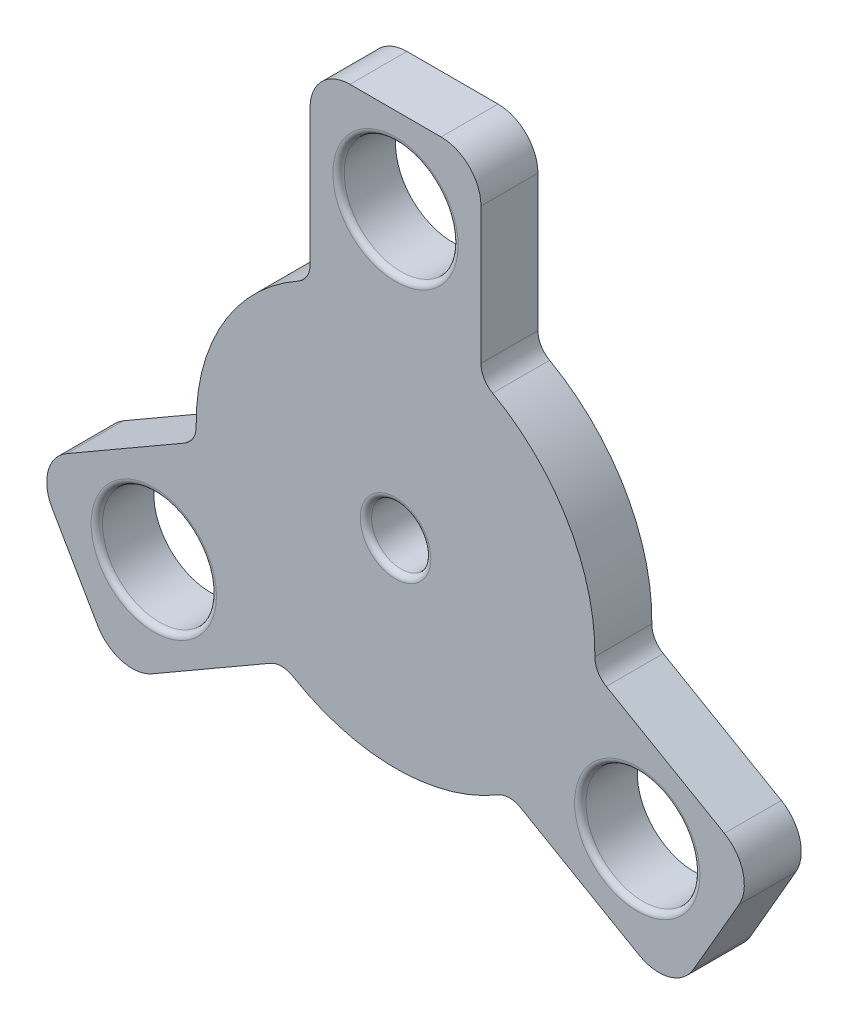
ISO-10303-21;
HEADER;
FILE_DESCRIPTION(('STEP AP214'),'2;1');
FILE_NAME('part.step','',(''),(''),'','','');
FILE_SCHEMA(('AUTOMOTIVE_DESIGN { 1 0 10303 214 1 1 1 1 }'));
ENDSEC;
DATA;
#1=APPLICATION_CONTEXT('core data for automotive mechanical design processes');
#2=APPLICATION_PROTOCOL_DEFINITION('international standard','automotive_design',2000,#1);
#3=PRODUCT_CONTEXT('',#1,'mechanical');
#4=PRODUCT('Part','Part','',(#3));
#5=PRODUCT_RELATED_PRODUCT_CATEGORY('part','',(#4));
#6=PRODUCT_DEFINITION_FORMATION('','',#4);
#7=PRODUCT_DEFINITION_CONTEXT('part definition',#1,'design');
#8=PRODUCT_DEFINITION('design','',#6,#7);
#9=PRODUCT_DEFINITION_SHAPE('','',#8);
#10=(LENGTH_UNIT() NAMED_UNIT(*) SI_UNIT(.MILLI.,.METRE.));
#11=(NAMED_UNIT(*) PLANE_ANGLE_UNIT() SI_UNIT($,.RADIAN.));
#12=(NAMED_UNIT(*) SI_UNIT($,.STERADIAN.) SOLID_ANGLE_UNIT());
#13=UNCERTAINTY_MEASURE_WITH_UNIT(LENGTH_MEASURE(1.E-05),#10,'distance_accuracy_value','');
#14=(GEOMETRIC_REPRESENTATION_CONTEXT(3) GLOBAL_UNCERTAINTY_ASSIGNED_CONTEXT((#13)) GLOBAL_UNIT_ASSIGNED_CONTEXT((#10,
#11,#12)) REPRESENTATION_CONTEXT('',''));
#15=CARTESIAN_POINT('',(0.,0.,0.));
#16=DIRECTION('',(0.,0.,1.));
#17=DIRECTION('',(1.,0.,0.));
#18=AXIS2_PLACEMENT_3D('',#15,#16,#17);
#19=CARTESIAN_POINT('',(3.75000000000002,-6.49519052838327,5.));
#20=DIRECTION('',(-0.500000000000003,0.866025403784437,0.));
#21=DIRECTION('',(-0.866025403784437,-0.500000000000003,0.));
#22=AXIS2_PLACEMENT_3D('',#19,#20,#21);
#23=PLANE('',#22);
#24=DIRECTION('',(0.866025403784437,0.500000000000003,0.));
#25=VECTOR('',#24,1.);
#26=CARTESIAN_POINT('',(3.75000000000002,-6.49519052838327,0.));
#27=LINE('',#26,#25);
#28=CARTESIAN_POINT('',(-21.3647367097487,-20.9951905283834,0.));
#29=VERTEX_POINT('',#28);
#30=CARTESIAN_POINT('',(-10.9978812037526,-15.0098837113465,0.));
#31=VERTEX_POINT('',#30);
#32=EDGE_CURVE('E556',#29,#31,#27,.T.);
#33=ORIENTED_EDGE('',*,*,#32,.T.);
#34=DIRECTION('',(0.,0.,1.));
#35=VECTOR('',#34,1.);
#36=CARTESIAN_POINT('',(-10.9978812037526,-15.0098837113465,5.));
#37=LINE('',#36,#35);
#38=CARTESIAN_POINT('',(-10.9978812037526,-15.0098837113465,5.));
#39=VERTEX_POINT('',#38);
#40=EDGE_CURVE('E353',#31,#39,#37,.T.);
#41=ORIENTED_EDGE('',*,*,#40,.T.);
#42=DIRECTION('',(0.866025403784437,0.500000000000003,0.));
#43=VECTOR('',#42,1.);
#44=CARTESIAN_POINT('',(3.75000000000002,-6.49519052838327,5.));
#45=LINE('',#44,#43);
#46=CARTESIAN_POINT('',(-21.3647367097487,-20.9951905283834,5.));
#47=VERTEX_POINT('',#46);
#48=EDGE_CURVE('E593',#47,#39,#45,.T.);
#49=ORIENTED_EDGE('',*,*,#48,.F.);
#50=DIRECTION('',(0.,0.,-1.));
#51=VECTOR('',#50,1.);
#52=CARTESIAN_POINT('',(-21.3647367097487,-20.9951905283833,5.));
#53=LINE('',#52,#51);
#54=EDGE_CURVE('E314',#47,#29,#53,.T.);
#55=ORIENTED_EDGE('',*,*,#54,.T.);
#56=EDGE_LOOP('',(#33,#41,#49,#55));
#57=FACE_BOUND('',#56,.T.);
#58=ADVANCED_FACE('F47',(#57),#23,.F.);
#59=CARTESIAN_POINT('',(0.,0.,5.));
#60=DIRECTION('',(0.,0.,-1.));
#61=DIRECTION('',(-1.,0.,0.));
#62=AXIS2_PLACEMENT_3D('',#59,#60,#61);
#63=CYLINDRICAL_SURFACE('',#62,17.5);
#64=CARTESIAN_POINT('',(0.,0.,5.));
#65=DIRECTION('',(0.,0.,1.));
#66=DIRECTION('',(1.,0.,0.));
#67=AXIS2_PLACEMENT_3D('',#64,#65,#66);
#68=CIRCLE('',#67,17.5);
#69=CARTESIAN_POINT('',(-8.97245749054719,-15.0248130297959,5.));
#70=VERTEX_POINT('',#69);
#71=CARTESIAN_POINT('',(8.97245749054727,-15.0248130297958,5.));
#72=VERTEX_POINT('',#71);
#73=EDGE_CURVE('E590',#70,#72,#68,.T.);
#74=ORIENTED_EDGE('',*,*,#73,.F.);
#75=DIRECTION('',(0.,0.,-1.));
#76=VECTOR('',#75,1.);
#77=CARTESIAN_POINT('',(-8.97245749054719,-15.0248130297959,5.));
#78=LINE('',#77,#76);
#79=CARTESIAN_POINT('',(-8.97245749054719,-15.0248130297959,0.));
#80=VERTEX_POINT('',#79);
#81=EDGE_CURVE('E349',#70,#80,#78,.T.);
#82=ORIENTED_EDGE('',*,*,#81,.T.);
#83=CARTESIAN_POINT('',(0.,0.,0.));
#84=DIRECTION('',(0.,0.,1.));
#85=DIRECTION('',(1.,0.,0.));
#86=AXIS2_PLACEMENT_3D('',#83,#84,#85);
#87=CIRCLE('',#86,17.5);
#88=CARTESIAN_POINT('',(8.97245749054727,-15.0248130297958,0.));
#89=VERTEX_POINT('',#88);
#90=EDGE_CURVE('E552',#80,#89,#87,.T.);
#91=ORIENTED_EDGE('',*,*,#90,.T.);
#92=DIRECTION('',(0.,0.,-1.));
#93=VECTOR('',#92,1.);
#94=CARTESIAN_POINT('',(8.97245749054727,-15.0248130297958,5.));
#95=LINE('',#94,#93);
#96=EDGE_CURVE('E346',#89,#72,#95,.F.);
#97=ORIENTED_EDGE('',*,*,#96,.T.);
#98=EDGE_LOOP('',(#74,#82,#91,#97));
#99=FACE_BOUND('',#98,.T.);
#100=ADVANCED_FACE('F437',(#99),#63,.T.);
#101=CARTESIAN_POINT('',(-3.74999999999998,-6.49519052838328,5.));
#102=DIRECTION('',(-0.499999999999998,-0.86602540378444,0.));
#103=DIRECTION('',(0.86602540378444,-0.499999999999998,0.));
#104=AXIS2_PLACEMENT_3D('',#101,#102,#103);
#105=PLANE('',#104);
#106=DIRECTION('',(-0.86602540378444,0.499999999999998,0.));
#107=VECTOR('',#106,1.);
#108=CARTESIAN_POINT('',(-3.74999999999998,-6.49519052838328,5.));
#109=LINE('',#108,#107);
#110=CARTESIAN_POINT('',(21.3647367097488,-20.9951905283832,5.));
#111=VERTEX_POINT('',#110);
#112=CARTESIAN_POINT('',(10.9978812037527,-15.0098837113465,5.));
#113=VERTEX_POINT('',#112);
#114=EDGE_CURVE('E587',#111,#113,#109,.T.);
#115=ORIENTED_EDGE('',*,*,#114,.T.);
#116=DIRECTION('',(0.,0.,-1.));
#117=VECTOR('',#116,1.);
#118=CARTESIAN_POINT('',(10.9978812037527,-15.0098837113465,5.));
#119=LINE('',#118,#117);
#120=CARTESIAN_POINT('',(10.9978812037527,-15.0098837113465,0.));
#121=VERTEX_POINT('',#120);
#122=EDGE_CURVE('E356',#113,#121,#119,.T.);
#123=ORIENTED_EDGE('',*,*,#122,.T.);
#124=DIRECTION('',(-0.86602540378444,0.499999999999998,0.));
#125=VECTOR('',#124,1.);
#126=CARTESIAN_POINT('',(-3.74999999999998,-6.49519052838328,0.));
#127=LINE('',#126,#125);
#128=CARTESIAN_POINT('',(21.3647367097488,-20.9951905283832,0.));
#129=VERTEX_POINT('',#128);
#130=EDGE_CURVE('E236',#129,#121,#127,.T.);
#131=ORIENTED_EDGE('',*,*,#130,.F.);
#132=DIRECTION('',(0.,0.,-1.));
#133=VECTOR('',#132,1.);
#134=CARTESIAN_POINT('',(21.3647367097488,-20.9951905283832,5.));
#135=LINE('',#134,#133);
#136=EDGE_CURVE('E267',#129,#111,#135,.F.);
#137=ORIENTED_EDGE('',*,*,#136,.T.);
#138=EDGE_LOOP('',(#115,#123,#131,#137));
#139=FACE_BOUND('',#138,.T.);
#140=ADVANCED_FACE('F444',(#139),#105,.T.);
#141=CARTESIAN_POINT('',(28.1458256229943,-16.2499999999999,5.));
#142=DIRECTION('',(0.86602540378444,-0.499999999999998,0.));
#143=DIRECTION('',(0.499999999999998,0.86602540378444,0.));
#144=AXIS2_PLACEMENT_3D('',#141,#142,#143);
#145=PLANE('',#144);
#146=DIRECTION('',(-0.499999999999998,-0.86602540378444,0.));
#147=VECTOR('',#146,1.);
#148=CARTESIAN_POINT('',(28.1458256229943,-16.2499999999999,5.));
#149=LINE('',#148,#147);
#150=CARTESIAN_POINT('',(30.1458256229943,-12.7858983848622,5.));
#151=VERTEX_POINT('',#150);
#152=CARTESIAN_POINT('',(26.1458256229943,-19.7141016151377,5.));
#153=VERTEX_POINT('',#152);
#154=EDGE_CURVE('E584',#151,#153,#149,.T.);
#155=ORIENTED_EDGE('',*,*,#154,.T.);
#156=DIRECTION('',(0.,0.,-1.));
#157=VECTOR('',#156,1.);
#158=CARTESIAN_POINT('',(26.1458256229943,-19.7141016151377,5.));
#159=LINE('',#158,#157);
#160=CARTESIAN_POINT('',(26.1458256229943,-19.7141016151377,0.));
#161=VERTEX_POINT('',#160);
#162=EDGE_CURVE('E234',#153,#161,#159,.T.);
#163=ORIENTED_EDGE('',*,*,#162,.T.);
#164=DIRECTION('',(-0.499999999999998,-0.86602540378444,0.));
#165=VECTOR('',#164,1.);
#166=CARTESIAN_POINT('',(28.1458256229943,-16.2499999999999,0.));
#167=LINE('',#166,#165);
#168=CARTESIAN_POINT('',(30.1458256229943,-12.7858983848622,0.));
#169=VERTEX_POINT('',#168);
#170=EDGE_CURVE('E216',#169,#161,#167,.T.);
#171=ORIENTED_EDGE('',*,*,#170,.F.);
#172=DIRECTION('',(0.,0.,-1.));
#173=VECTOR('',#172,1.);
#174=CARTESIAN_POINT('',(30.1458256229943,-12.7858983848622,5.));
#175=LINE('',#174,#173);
#176=EDGE_CURVE('E231',#169,#151,#175,.F.);
#177=ORIENTED_EDGE('',*,*,#176,.T.);
#178=EDGE_LOOP('',(#155,#163,#171,#177));
#179=FACE_BOUND('',#178,.T.);
#180=ADVANCED_FACE('F230',(#179),#145,.T.);
#181=CARTESIAN_POINT('',(3.74999999999999,6.4951905283833,5.));
#182=DIRECTION('',(-0.499999999999998,-0.86602540378444,0.));
#183=DIRECTION('',(0.86602540378444,-0.499999999999998,0.));
#184=AXIS2_PLACEMENT_3D('',#181,#182,#183);
#185=PLANE('',#184);
#186=DIRECTION('',(-0.86602540378444,0.499999999999998,0.));
#187=VECTOR('',#186,1.);
#188=CARTESIAN_POINT('',(3.74999999999999,6.4951905283833,0.));
#189=LINE('',#188,#187);
#190=CARTESIAN_POINT('',(28.8647367097488,-8.00480947161664,0.));
#191=VERTEX_POINT('',#190);
#192=CARTESIAN_POINT('',(18.4978812037526,-2.01950265457986,0.));
#193=VERTEX_POINT('',#192);
#194=EDGE_CURVE('E218',#191,#193,#189,.T.);
#195=ORIENTED_EDGE('',*,*,#194,.T.);
#196=DIRECTION('',(0.,0.,1.));
#197=VECTOR('',#196,1.);
#198=CARTESIAN_POINT('',(18.4978812037526,-2.01950265457986,5.));
#199=LINE('',#198,#197);
#200=CARTESIAN_POINT('',(18.4978812037526,-2.01950265457986,5.));
#201=VERTEX_POINT('',#200);
#202=EDGE_CURVE('E339',#193,#201,#199,.T.);
#203=ORIENTED_EDGE('',*,*,#202,.T.);
#204=DIRECTION('',(-0.86602540378444,0.499999999999998,0.));
#205=VECTOR('',#204,1.);
#206=CARTESIAN_POINT('',(3.74999999999999,6.4951905283833,5.));
#207=LINE('',#206,#205);
#208=CARTESIAN_POINT('',(28.8647367097488,-8.00480947161664,5.));
#209=VERTEX_POINT('',#208);
#210=EDGE_CURVE('E580',#209,#201,#207,.T.);
#211=ORIENTED_EDGE('',*,*,#210,.F.);
#212=DIRECTION('',(0.,0.,-1.));
#213=VECTOR('',#212,1.);
#214=CARTESIAN_POINT('',(28.8647367097487,-8.00480947161664,0.));
#215=LINE('',#214,#213);
#216=EDGE_CURVE('E287',#209,#191,#215,.T.);
#217=ORIENTED_EDGE('',*,*,#216,.T.);
#218=EDGE_LOOP('',(#195,#203,#211,#217));
#219=FACE_BOUND('',#218,.T.);
#220=ADVANCED_FACE('F635',(#219),#185,.F.);
#221=CARTESIAN_POINT('',(17.4980985161883,-0.257969606291903,5.));
#222=VERTEX_POINT('',#221);
#223=CARTESIAN_POINT('',(8.52564102564103,15.2827826360878,5.));
#224=VERTEX_POINT('',#223);
#225=EDGE_CURVE('E579',#222,#224,#68,.T.);
#226=ORIENTED_EDGE('',*,*,#225,.F.);
#227=DIRECTION('',(0.,0.,-1.));
#228=VECTOR('',#227,1.);
#229=CARTESIAN_POINT('',(17.4980985161883,-0.257969606291903,5.));
#230=LINE('',#229,#228);
#231=CARTESIAN_POINT('',(17.4980985161883,-0.257969606291903,0.));
#232=VERTEX_POINT('',#231);
#233=EDGE_CURVE('E335',#222,#232,#230,.T.);
#234=ORIENTED_EDGE('',*,*,#233,.T.);
#235=CARTESIAN_POINT('',(8.52564102564103,15.2827826360878,0.));
#236=VERTEX_POINT('',#235);
#237=EDGE_CURVE('E546',#232,#236,#87,.T.);
#238=ORIENTED_EDGE('',*,*,#237,.T.);
#239=DIRECTION('',(0.,0.,-1.));
#240=VECTOR('',#239,1.);
#241=CARTESIAN_POINT('',(8.52564102564103,15.2827826360878,5.));
#242=LINE('',#241,#240);
#243=EDGE_CURVE('E332',#236,#224,#242,.F.);
#244=ORIENTED_EDGE('',*,*,#243,.T.);
#245=EDGE_LOOP('',(#226,#234,#238,#244));
#246=FACE_BOUND('',#245,.T.);
#247=ADVANCED_FACE('F447',(#246),#63,.T.);
#248=CARTESIAN_POINT('',(7.5,0.,5.));
#249=DIRECTION('',(1.,0.,0.));
#250=DIRECTION('',(0.,1.,0.));
#251=AXIS2_PLACEMENT_3D('',#248,#249,#250);
#252=PLANE('',#251);
#253=DIRECTION('',(0.,-1.,0.));
#254=VECTOR('',#253,1.);
#255=CARTESIAN_POINT('',(7.5,0.,5.));
#256=LINE('',#255,#254);
#257=CARTESIAN_POINT('',(7.5,29.,5.));
#258=VERTEX_POINT('',#257);
#259=CARTESIAN_POINT('',(7.5,17.0293863659264,5.));
#260=VERTEX_POINT('',#259);
#261=EDGE_CURVE('E575',#258,#260,#256,.T.);
#262=ORIENTED_EDGE('',*,*,#261,.T.);
#263=DIRECTION('',(0.,0.,-1.));
#264=VECTOR('',#263,1.);
#265=CARTESIAN_POINT('',(7.5,17.0293863659264,5.));
#266=LINE('',#265,#264);
#267=CARTESIAN_POINT('',(7.5,17.0293863659264,0.));
#268=VERTEX_POINT('',#267);
#269=EDGE_CURVE('E342',#260,#268,#266,.T.);
#270=ORIENTED_EDGE('',*,*,#269,.T.);
#271=DIRECTION('',(0.,-1.,0.));
#272=VECTOR('',#271,1.);
#273=CARTESIAN_POINT('',(7.5,0.,0.));
#274=LINE('',#273,#272);
#275=CARTESIAN_POINT('',(7.5,29.,0.));
#276=VERTEX_POINT('',#275);
#277=EDGE_CURVE('E542',#276,#268,#274,.T.);
#278=ORIENTED_EDGE('',*,*,#277,.F.);
#279=DIRECTION('',(0.,0.,-1.));
#280=VECTOR('',#279,1.);
#281=CARTESIAN_POINT('',(7.5,29.,5.));
#282=LINE('',#281,#280);
#283=EDGE_CURVE('E297',#276,#258,#282,.F.);
#284=ORIENTED_EDGE('',*,*,#283,.T.);
#285=EDGE_LOOP('',(#262,#270,#278,#284));
#286=FACE_BOUND('',#285,.T.);
#287=ADVANCED_FACE('F630',(#286),#252,.T.);
#288=CARTESIAN_POINT('',(0.,32.5,5.));
#289=DIRECTION('',(0.,1.,0.));
#290=DIRECTION('',(0.,0.,1.));
#291=AXIS2_PLACEMENT_3D('',#288,#289,#290);
#292=PLANE('',#291);
#293=DIRECTION('',(1.,0.,0.));
#294=VECTOR('',#293,1.);
#295=CARTESIAN_POINT('',(0.,32.5,5.));
#296=LINE('',#295,#294);
#297=CARTESIAN_POINT('',(-4.,32.5,5.));
#298=VERTEX_POINT('',#297);
#299=CARTESIAN_POINT('',(4.,32.5,5.));
#300=VERTEX_POINT('',#299);
#301=EDGE_CURVE('E571',#298,#300,#296,.T.);
#302=ORIENTED_EDGE('',*,*,#301,.T.);
#303=DIRECTION('',(0.,0.,-1.));
#304=VECTOR('',#303,1.);
#305=CARTESIAN_POINT('',(4.,32.5,5.));
#306=LINE('',#305,#304);
#307=CARTESIAN_POINT('',(4.,32.5,0.));
#308=VERTEX_POINT('',#307);
#309=EDGE_CURVE('E293',#300,#308,#306,.T.);
#310=ORIENTED_EDGE('',*,*,#309,.T.);
#311=DIRECTION('',(1.,0.,0.));
#312=VECTOR('',#311,1.);
#313=CARTESIAN_POINT('',(0.,32.5,0.));
#314=LINE('',#313,#312);
#315=CARTESIAN_POINT('',(-4.,32.5,0.));
#316=VERTEX_POINT('',#315);
#317=EDGE_CURVE('E538',#316,#308,#314,.T.);
#318=ORIENTED_EDGE('',*,*,#317,.F.);
#319=DIRECTION('',(0.,0.,-1.));
#320=VECTOR('',#319,1.);
#321=CARTESIAN_POINT('',(-4.,32.5,5.));
#322=LINE('',#321,#320);
#323=EDGE_CURVE('E290',#316,#298,#322,.F.);
#324=ORIENTED_EDGE('',*,*,#323,.T.);
#325=EDGE_LOOP('',(#302,#310,#318,#324));
#326=FACE_BOUND('',#325,.T.);
#327=ADVANCED_FACE('F626',(#326),#292,.T.);
#328=CARTESIAN_POINT('',(-7.5,0.,5.));
#329=DIRECTION('',(1.,0.,0.));
#330=DIRECTION('',(0.,1.,0.));
#331=AXIS2_PLACEMENT_3D('',#328,#329,#330);
#332=PLANE('',#331);
#333=DIRECTION('',(0.,-1.,0.));
#334=VECTOR('',#333,1.);
#335=CARTESIAN_POINT('',(-7.5,0.,0.));
#336=LINE('',#335,#334);
#337=CARTESIAN_POINT('',(-7.5,29.,0.));
#338=VERTEX_POINT('',#337);
#339=CARTESIAN_POINT('',(-7.5,17.0293863659264,0.));
#340=VERTEX_POINT('',#339);
#341=EDGE_CURVE('E534',#338,#340,#336,.T.);
#342=ORIENTED_EDGE('',*,*,#341,.T.);
#343=DIRECTION('',(0.,0.,1.));
#344=VECTOR('',#343,1.);
#345=CARTESIAN_POINT('',(-7.5,17.0293863659264,5.));
#346=LINE('',#345,#344);
#347=CARTESIAN_POINT('',(-7.5,17.0293863659264,5.));
#348=VERTEX_POINT('',#347);
#349=EDGE_CURVE('E329',#340,#348,#346,.T.);
#350=ORIENTED_EDGE('',*,*,#349,.T.);
#351=DIRECTION('',(0.,-1.,0.));
#352=VECTOR('',#351,1.);
#353=CARTESIAN_POINT('',(-7.5,0.,5.));
#354=LINE('',#353,#352);
#355=CARTESIAN_POINT('',(-7.5,29.,5.));
#356=VERTEX_POINT('',#355);
#357=EDGE_CURVE('E567',#356,#348,#354,.T.);
#358=ORIENTED_EDGE('',*,*,#357,.F.);
#359=DIRECTION('',(0.,0.,-1.));
#360=VECTOR('',#359,1.);
#361=CARTESIAN_POINT('',(-7.5,29.,0.));
#362=LINE('',#361,#360);
#363=EDGE_CURVE('E300',#356,#338,#362,.T.);
#364=ORIENTED_EDGE('',*,*,#363,.T.);
#365=EDGE_LOOP('',(#342,#350,#358,#364));
#366=FACE_BOUND('',#365,.T.);
#367=ADVANCED_FACE('F622',(#366),#332,.F.);
#368=CARTESIAN_POINT('',(-8.52564102564103,15.2827826360878,0.));
#369=VERTEX_POINT('',#368);
#370=CARTESIAN_POINT('',(-17.4980985161883,-0.257969606292012,0.));
#371=VERTEX_POINT('',#370);
#372=EDGE_CURVE('E533',#369,#371,#87,.T.);
#373=ORIENTED_EDGE('',*,*,#372,.T.);
#374=DIRECTION('',(0.,0.,-1.));
#375=VECTOR('',#374,1.);
#376=CARTESIAN_POINT('',(-17.4980985161883,-0.257969606292012,5.));
#377=LINE('',#376,#375);
#378=CARTESIAN_POINT('',(-17.4980985161883,-0.257969606292012,5.));
#379=VERTEX_POINT('',#378);
#380=EDGE_CURVE('E326',#371,#379,#377,.F.);
#381=ORIENTED_EDGE('',*,*,#380,.T.);
#382=CARTESIAN_POINT('',(-8.52564102564103,15.2827826360878,5.));
#383=VERTEX_POINT('',#382);
#384=EDGE_CURVE('E566',#383,#379,#68,.T.);
#385=ORIENTED_EDGE('',*,*,#384,.F.);
#386=DIRECTION('',(0.,0.,-1.));
#387=VECTOR('',#386,1.);
#388=CARTESIAN_POINT('',(-8.52564102564103,15.2827826360878,5.));
#389=LINE('',#388,#387);
#390=EDGE_CURVE('E322',#383,#369,#389,.T.);
#391=ORIENTED_EDGE('',*,*,#390,.T.);
#392=EDGE_LOOP('',(#373,#381,#385,#391));
#393=FACE_BOUND('',#392,.T.);
#394=ADVANCED_FACE('F448',(#393),#63,.T.);
#395=CARTESIAN_POINT('',(-3.75,6.49519052838327,5.));
#396=DIRECTION('',(-0.500000000000002,0.866025403784438,0.));
#397=DIRECTION('',(-0.866025403784438,-0.500000000000002,0.));
#398=AXIS2_PLACEMENT_3D('',#395,#396,#397);
#399=PLANE('',#398);
#400=DIRECTION('',(0.866025403784438,0.500000000000002,0.));
#401=VECTOR('',#400,1.);
#402=CARTESIAN_POINT('',(-3.75,6.49519052838327,5.));
#403=LINE('',#402,#401);
#404=CARTESIAN_POINT('',(-28.8647367097487,-8.00480947161679,5.));
#405=VERTEX_POINT('',#404);
#406=CARTESIAN_POINT('',(-18.4978812037526,-2.01950265457997,5.));
#407=VERTEX_POINT('',#406);
#408=EDGE_CURVE('E249',#405,#407,#403,.T.);
#409=ORIENTED_EDGE('',*,*,#408,.T.);
#410=DIRECTION('',(0.,0.,-1.));
#411=VECTOR('',#410,1.);
#412=CARTESIAN_POINT('',(-18.4978812037526,-2.01950265457997,5.));
#413=LINE('',#412,#411);
#414=CARTESIAN_POINT('',(-18.4978812037526,-2.01950265457997,0.));
#415=VERTEX_POINT('',#414);
#416=EDGE_CURVE('E318',#407,#415,#413,.T.);
#417=ORIENTED_EDGE('',*,*,#416,.T.);
#418=DIRECTION('',(0.866025403784438,0.500000000000002,0.));
#419=VECTOR('',#418,1.);
#420=CARTESIAN_POINT('',(-3.75,6.49519052838327,0.));
#421=LINE('',#420,#419);
#422=CARTESIAN_POINT('',(-28.8647367097487,-8.00480947161679,0.));
#423=VERTEX_POINT('',#422);
#424=EDGE_CURVE('E527',#423,#415,#421,.T.);
#425=ORIENTED_EDGE('',*,*,#424,.F.);
#426=DIRECTION('',(0.,0.,-1.));
#427=VECTOR('',#426,1.);
#428=CARTESIAN_POINT('',(-28.8647367097487,-8.00480947161679,5.));
#429=LINE('',#428,#427);
#430=EDGE_CURVE('E311',#423,#405,#429,.F.);
#431=ORIENTED_EDGE('',*,*,#430,.T.);
#432=EDGE_LOOP('',(#409,#417,#425,#431));
#433=FACE_BOUND('',#432,.T.);
#434=ADVANCED_FACE('F612',(#433),#399,.T.);
#435=CARTESIAN_POINT('',(0.,25.,5.));
#436=DIRECTION('',(0.,0.,-1.));
#437=DIRECTION('',(-1.,0.,0.));
#438=AXIS2_PLACEMENT_3D('',#435,#436,#437);
#439=CYLINDRICAL_SURFACE('',#438,5.);
#440=CARTESIAN_POINT('',(0.,25.,4.5));
#441=DIRECTION('',(0.,0.,1.));
#442=DIRECTION('',(1.,0.,0.));
#443=AXIS2_PLACEMENT_3D('',#440,#441,#442);
#444=CIRCLE('',#443,5.);
#445=CARTESIAN_POINT('',(5.,25.,4.5));
#446=VERTEX_POINT('',#445);
#447=EDGE_CURVE('E11',#446,#446,#444,.T.);
#448=ORIENTED_EDGE('',*,*,#447,.T.);
#449=EDGE_LOOP('',(#448));
#450=FACE_BOUND('',#449,.T.);
#451=CARTESIAN_POINT('',(0.,25.,0.));
#452=DIRECTION('',(0.,0.,1.));
#453=DIRECTION('',(1.,0.,0.));
#454=AXIS2_PLACEMENT_3D('',#451,#452,#453);
#455=CIRCLE('',#454,5.);
#456=CARTESIAN_POINT('',(5.,25.,0.));
#457=VERTEX_POINT('',#456);
#458=EDGE_CURVE('E520',#457,#457,#455,.T.);
#459=ORIENTED_EDGE('',*,*,#458,.F.);
#460=EDGE_LOOP('',(#459));
#461=FACE_BOUND('',#460,.T.);
#462=ADVANCED_FACE('F514',(#450,#461),#439,.F.);
#463=CARTESIAN_POINT('',(0.,0.,5.));
#464=DIRECTION('',(0.,0.,-1.));
#465=DIRECTION('',(-1.,0.,0.));
#466=AXIS2_PLACEMENT_3D('',#463,#464,#465);
#467=CYLINDRICAL_SURFACE('',#466,2.6);
#468=CARTESIAN_POINT('',(0.,0.,4.5));
#469=DIRECTION('',(0.,0.,1.));
#470=DIRECTION('',(1.,0.,0.));
#471=AXIS2_PLACEMENT_3D('',#468,#469,#470);
#472=CIRCLE('',#471,2.6);
#473=CARTESIAN_POINT('',(2.6,0.,4.5));
#474=VERTEX_POINT('',#473);
#475=EDGE_CURVE('E393',#474,#474,#472,.T.);
#476=ORIENTED_EDGE('',*,*,#475,.T.);
#477=EDGE_LOOP('',(#476));
#478=FACE_BOUND('',#477,.T.);
#479=CARTESIAN_POINT('',(0.,0.,0.));
#480=DIRECTION('',(0.,0.,1.));
#481=DIRECTION('',(1.,0.,0.));
#482=AXIS2_PLACEMENT_3D('',#479,#480,#481);
#483=CIRCLE('',#482,2.6);
#484=CARTESIAN_POINT('',(2.6,0.,0.));
#485=VERTEX_POINT('',#484);
#486=EDGE_CURVE('E518',#485,#485,#483,.T.);
#487=ORIENTED_EDGE('',*,*,#486,.F.);
#488=EDGE_LOOP('',(#487));
#489=FACE_BOUND('',#488,.T.);
#490=ADVANCED_FACE('F511',(#478,#489),#467,.F.);
#491=CARTESIAN_POINT('',(-28.1458256229942,-16.2500000000001,5.));
#492=DIRECTION('',(0.866025403784437,0.500000000000002,0.));
#493=DIRECTION('',(-0.500000000000002,0.866025403784437,0.));
#494=AXIS2_PLACEMENT_3D('',#491,#492,#493);
#495=PLANE('',#494);
#496=DIRECTION('',(0.500000000000002,-0.866025403784437,0.));
#497=VECTOR('',#496,1.);
#498=CARTESIAN_POINT('',(-28.1458256229942,-16.2500000000001,5.));
#499=LINE('',#498,#497);
#500=CARTESIAN_POINT('',(-30.1458256229942,-12.7858983848623,5.));
#501=VERTEX_POINT('',#500);
#502=CARTESIAN_POINT('',(-26.1458256229942,-19.7141016151378,5.));
#503=VERTEX_POINT('',#502);
#504=EDGE_CURVE('E242',#501,#503,#499,.T.);
#505=ORIENTED_EDGE('',*,*,#504,.F.);
#506=DIRECTION('',(0.,0.,-1.));
#507=VECTOR('',#506,1.);
#508=CARTESIAN_POINT('',(-30.1458256229942,-12.7858983848623,0.));
#509=LINE('',#508,#507);
#510=CARTESIAN_POINT('',(-30.1458256229942,-12.7858983848623,0.));
#511=VERTEX_POINT('',#510);
#512=EDGE_CURVE('E307',#501,#511,#509,.T.);
#513=ORIENTED_EDGE('',*,*,#512,.T.);
#514=DIRECTION('',(0.500000000000002,-0.866025403784437,0.));
#515=VECTOR('',#514,1.);
#516=CARTESIAN_POINT('',(-28.1458256229942,-16.2500000000001,0.));
#517=LINE('',#516,#515);
#518=CARTESIAN_POINT('',(-26.1458256229942,-19.7141016151378,0.));
#519=VERTEX_POINT('',#518);
#520=EDGE_CURVE('E521',#511,#519,#517,.T.);
#521=ORIENTED_EDGE('',*,*,#520,.T.);
#522=DIRECTION('',(0.,0.,-1.));
#523=VECTOR('',#522,1.);
#524=CARTESIAN_POINT('',(-26.1458256229942,-19.7141016151378,5.));
#525=LINE('',#524,#523);
#526=EDGE_CURVE('E304',#519,#503,#525,.F.);
#527=ORIENTED_EDGE('',*,*,#526,.T.);
#528=EDGE_LOOP('',(#505,#513,#521,#527));
#529=FACE_BOUND('',#528,.T.);
#530=ADVANCED_FACE('F456',(#529),#495,.F.);
#531=CARTESIAN_POINT('',(-21.2176223927187,-12.2500000000001,5.));
#532=DIRECTION('',(0.,0.,-1.));
#533=DIRECTION('',(-1.,0.,0.));
#534=AXIS2_PLACEMENT_3D('',#531,#532,#533);
#535=CYLINDRICAL_SURFACE('',#534,5.);
#536=CARTESIAN_POINT('',(-21.2176223927187,-12.2500000000001,4.5));
#537=DIRECTION('',(0.,0.,1.));
#538=DIRECTION('',(1.,0.,0.));
#539=AXIS2_PLACEMENT_3D('',#536,#537,#538);
#540=CIRCLE('',#539,5.);
#541=CARTESIAN_POINT('',(-16.2176223927187,-12.2500000000001,4.5));
#542=VERTEX_POINT('',#541);
#543=EDGE_CURVE('E413',#542,#542,#540,.T.);
#544=ORIENTED_EDGE('',*,*,#543,.T.);
#545=EDGE_LOOP('',(#544));
#546=FACE_BOUND('',#545,.T.);
#547=CARTESIAN_POINT('',(-21.2176223927187,-12.2500000000001,0.));
#548=DIRECTION('',(0.,0.,1.));
#549=DIRECTION('',(1.,0.,0.));
#550=AXIS2_PLACEMENT_3D('',#547,#548,#549);
#551=CIRCLE('',#550,5.);
#552=CARTESIAN_POINT('',(-16.2176223927187,-12.2500000000001,0.));
#553=VERTEX_POINT('',#552);
#554=EDGE_CURVE('E559',#553,#553,#551,.T.);
#555=ORIENTED_EDGE('',*,*,#554,.F.);
#556=EDGE_LOOP('',(#555));
#557=FACE_BOUND('',#556,.T.);
#558=ADVANCED_FACE('F453',(#546,#557),#535,.F.);
#559=CARTESIAN_POINT('',(21.2176223927188,-12.2499999999999,5.));
#560=DIRECTION('',(0.,0.,-1.));
#561=DIRECTION('',(-1.,0.,0.));
#562=AXIS2_PLACEMENT_3D('',#559,#560,#561);
#563=CYLINDRICAL_SURFACE('',#562,5.);
#564=CARTESIAN_POINT('',(21.2176223927188,-12.2499999999999,4.5));
#565=DIRECTION('',(0.,0.,1.));
#566=DIRECTION('',(1.,0.,0.));
#567=AXIS2_PLACEMENT_3D('',#564,#565,#566);
#568=CIRCLE('',#567,5.);
#569=CARTESIAN_POINT('',(26.2176223927188,-12.2499999999999,4.5));
#570=VERTEX_POINT('',#569);
#571=EDGE_CURVE('E56',#570,#570,#568,.T.);
#572=ORIENTED_EDGE('',*,*,#571,.T.);
#573=EDGE_LOOP('',(#572));
#574=FACE_BOUND('',#573,.T.);
#575=CARTESIAN_POINT('',(21.2176223927188,-12.2499999999999,0.));
#576=DIRECTION('',(0.,0.,1.));
#577=DIRECTION('',(1.,0.,0.));
#578=AXIS2_PLACEMENT_3D('',#575,#576,#577);
#579=CIRCLE('',#578,5.);
#580=CARTESIAN_POINT('',(26.2176223927188,-12.2499999999999,0.));
#581=VERTEX_POINT('',#580);
#582=EDGE_CURVE('E252',#581,#581,#579,.T.);
#583=ORIENTED_EDGE('',*,*,#582,.F.);
#584=EDGE_LOOP('',(#583));
#585=FACE_BOUND('',#584,.T.);
#586=ADVANCED_FACE('F420',(#574,#585),#563,.F.);
#587=CARTESIAN_POINT('',(0.,0.,5.));
#588=DIRECTION('',(0.,0.,1.));
#589=DIRECTION('',(1.,0.,0.));
#590=AXIS2_PLACEMENT_3D('',#587,#588,#589);
#591=PLANE('',#590);
#592=CARTESIAN_POINT('',(0.,0.,5.));
#593=DIRECTION('',(0.,0.,1.));
#594=DIRECTION('',(1.,0.,0.));
#595=AXIS2_PLACEMENT_3D('',#592,#593,#594);
#596=CIRCLE('',#595,3.1);
#597=CARTESIAN_POINT('',(3.1,0.,5.));
#598=VERTEX_POINT('',#597);
#599=EDGE_CURVE('E409',#598,#598,#596,.F.);
#600=ORIENTED_EDGE('',*,*,#599,.T.);
#601=EDGE_LOOP('',(#600));
#602=FACE_BOUND('',#601,.T.);
#603=CARTESIAN_POINT('',(-21.2176223927187,-12.2500000000001,5.));
#604=DIRECTION('',(0.,0.,1.));
#605=DIRECTION('',(1.,0.,0.));
#606=AXIS2_PLACEMENT_3D('',#603,#604,#605);
#607=CIRCLE('',#606,5.5);
#608=CARTESIAN_POINT('',(-15.7176223927187,-12.2500000000001,5.));
#609=VERTEX_POINT('',#608);
#610=EDGE_CURVE('E405',#609,#609,#607,.F.);
#611=ORIENTED_EDGE('',*,*,#610,.T.);
#612=EDGE_LOOP('',(#611));
#613=FACE_BOUND('',#612,.T.);
#614=CARTESIAN_POINT('',(21.2176223927188,-12.2499999999999,5.));
#615=DIRECTION('',(0.,0.,1.));
#616=DIRECTION('',(1.,0.,0.));
#617=AXIS2_PLACEMENT_3D('',#614,#615,#616);
#618=CIRCLE('',#617,5.5);
#619=CARTESIAN_POINT('',(26.7176223927188,-12.2499999999999,5.));
#620=VERTEX_POINT('',#619);
#621=EDGE_CURVE('E401',#620,#620,#618,.F.);
#622=ORIENTED_EDGE('',*,*,#621,.T.);
#623=EDGE_LOOP('',(#622));
#624=FACE_BOUND('',#623,.T.);
#625=CARTESIAN_POINT('',(0.,25.,5.));
#626=DIRECTION('',(0.,0.,1.));
#627=DIRECTION('',(1.,0.,0.));
#628=AXIS2_PLACEMENT_3D('',#625,#626,#627);
#629=CIRCLE('',#628,5.5);
#630=CARTESIAN_POINT('',(5.5,25.,5.));
#631=VERTEX_POINT('',#630);
#632=EDGE_CURVE('E397',#631,#631,#629,.F.);
#633=ORIENTED_EDGE('',*,*,#632,.T.);
#634=EDGE_LOOP('',(#633));
#635=FACE_BOUND('',#634,.T.);
#636=ORIENTED_EDGE('',*,*,#114,.F.);
#637=CARTESIAN_POINT('',(23.1147367097488,-17.9641016151377,5.));
#638=DIRECTION('',(0.,0.,1.));
#639=DIRECTION('',(1.,0.,0.));
#640=AXIS2_PLACEMENT_3D('',#637,#638,#639);
#641=CIRCLE('',#640,3.5);
#642=EDGE_CURVE('E284',#111,#153,#641,.T.);
#643=ORIENTED_EDGE('',*,*,#642,.T.);
#644=ORIENTED_EDGE('',*,*,#154,.F.);
#645=CARTESIAN_POINT('',(27.1147367097488,-11.0358983848622,5.));
#646=DIRECTION('',(0.,0.,1.));
#647=DIRECTION('',(1.,0.,0.));
#648=AXIS2_PLACEMENT_3D('',#645,#646,#647);
#649=CIRCLE('',#648,3.5);
#650=EDGE_CURVE('E240',#151,#209,#649,.T.);
#651=ORIENTED_EDGE('',*,*,#650,.T.);
#652=ORIENTED_EDGE('',*,*,#210,.T.);
#653=CARTESIAN_POINT('',(19.4978812037526,-0.287451847010978,5.));
#654=DIRECTION('',(0.,0.,1.));
#655=DIRECTION('',(1.,0.,0.));
#656=AXIS2_PLACEMENT_3D('',#653,#654,#655);
#657=CIRCLE('',#656,2.);
#658=EDGE_CURVE('E374',#201,#222,#657,.F.);
#659=ORIENTED_EDGE('',*,*,#658,.T.);
#660=ORIENTED_EDGE('',*,*,#225,.T.);
#661=CARTESIAN_POINT('',(9.5,17.0293863659264,5.));
#662=DIRECTION('',(0.,0.,1.));
#663=DIRECTION('',(1.,0.,0.));
#664=AXIS2_PLACEMENT_3D('',#661,#662,#663);
#665=CIRCLE('',#664,2.);
#666=EDGE_CURVE('E380',#224,#260,#665,.F.);
#667=ORIENTED_EDGE('',*,*,#666,.T.);
#668=ORIENTED_EDGE('',*,*,#261,.F.);
#669=CARTESIAN_POINT('',(4.,29.,5.));
#670=DIRECTION('',(0.,0.,1.));
#671=DIRECTION('',(1.,0.,0.));
#672=AXIS2_PLACEMENT_3D('',#669,#670,#671);
#673=CIRCLE('',#672,3.5);
#674=EDGE_CURVE('E279',#258,#300,#673,.T.);
#675=ORIENTED_EDGE('',*,*,#674,.T.);
#676=ORIENTED_EDGE('',*,*,#301,.F.);
#677=CARTESIAN_POINT('',(-4.,29.,5.));
#678=DIRECTION('',(0.,0.,1.));
#679=DIRECTION('',(1.,0.,0.));
#680=AXIS2_PLACEMENT_3D('',#677,#678,#679);
#681=CIRCLE('',#680,3.5);
#682=EDGE_CURVE('E276',#298,#356,#681,.T.);
#683=ORIENTED_EDGE('',*,*,#682,.T.);
#684=ORIENTED_EDGE('',*,*,#357,.T.);
#685=CARTESIAN_POINT('',(-9.5,17.0293863659264,5.));
#686=DIRECTION('',(0.,0.,1.));
#687=DIRECTION('',(1.,0.,0.));
#688=AXIS2_PLACEMENT_3D('',#685,#686,#687);
#689=CIRCLE('',#688,2.);
#690=EDGE_CURVE('E368',#348,#383,#689,.F.);
#691=ORIENTED_EDGE('',*,*,#690,.T.);
#692=ORIENTED_EDGE('',*,*,#384,.T.);
#693=CARTESIAN_POINT('',(-19.4978812037526,-0.287451847011099,5.));
#694=DIRECTION('',(0.,0.,1.));
#695=DIRECTION('',(1.,0.,0.));
#696=AXIS2_PLACEMENT_3D('',#693,#694,#695);
#697=CIRCLE('',#696,2.);
#698=EDGE_CURVE('E362',#379,#407,#697,.F.);
#699=ORIENTED_EDGE('',*,*,#698,.T.);
#700=ORIENTED_EDGE('',*,*,#408,.F.);
#701=CARTESIAN_POINT('',(-27.1147367097487,-11.0358983848623,5.));
#702=DIRECTION('',(0.,0.,1.));
#703=DIRECTION('',(1.,0.,0.));
#704=AXIS2_PLACEMENT_3D('',#701,#702,#703);
#705=CIRCLE('',#704,3.5);
#706=EDGE_CURVE('E273',#405,#501,#705,.T.);
#707=ORIENTED_EDGE('',*,*,#706,.T.);
#708=ORIENTED_EDGE('',*,*,#504,.T.);
#709=CARTESIAN_POINT('',(-23.1147367097487,-17.9641016151378,5.));
#710=DIRECTION('',(0.,0.,1.));
#711=DIRECTION('',(1.,0.,0.));
#712=AXIS2_PLACEMENT_3D('',#709,#710,#711);
#713=CIRCLE('',#712,3.5);
#714=EDGE_CURVE('E270',#503,#47,#713,.T.);
#715=ORIENTED_EDGE('',*,*,#714,.T.);
#716=ORIENTED_EDGE('',*,*,#48,.T.);
#717=CARTESIAN_POINT('',(-9.99788120375259,-16.7419345189154,5.));
#718=DIRECTION('',(0.,0.,1.));
#719=DIRECTION('',(1.,0.,0.));
#720=AXIS2_PLACEMENT_3D('',#717,#718,#719);
#721=CIRCLE('',#720,2.);
#722=EDGE_CURVE('E386',#39,#70,#721,.F.);
#723=ORIENTED_EDGE('',*,*,#722,.T.);
#724=ORIENTED_EDGE('',*,*,#73,.T.);
#725=CARTESIAN_POINT('',(9.99788120375268,-16.7419345189153,5.));
#726=DIRECTION('',(0.,0.,1.));
#727=DIRECTION('',(1.,0.,0.));
#728=AXIS2_PLACEMENT_3D('',#725,#726,#727);
#729=CIRCLE('',#728,2.);
#730=EDGE_CURVE('E63',#72,#113,#729,.F.);
#731=ORIENTED_EDGE('',*,*,#730,.T.);
#732=EDGE_LOOP('',(#636,#643,#644,#651,#652,#659,#660,#667,#668,#675,#676,#683,#684,#691,#692,
#699,#700,#707,#708,#715,#716,#723,#724,#731));
#733=FACE_BOUND('',#732,.T.);
#734=ADVANCED_FACE('F603',(#602,#613,#624,#635,#733),#591,.T.);
#735=CARTESIAN_POINT('',(0.,0.,0.));
#736=DIRECTION('',(0.,0.,1.));
#737=DIRECTION('',(1.,0.,0.));
#738=AXIS2_PLACEMENT_3D('',#735,#736,#737);
#739=PLANE('',#738);
#740=ORIENTED_EDGE('',*,*,#554,.T.);
#741=EDGE_LOOP('',(#740));
#742=FACE_BOUND('',#741,.T.);
#743=ORIENTED_EDGE('',*,*,#170,.T.);
#744=CARTESIAN_POINT('',(23.1147367097488,-17.9641016151377,0.));
#745=DIRECTION('',(0.,0.,1.));
#746=DIRECTION('',(1.,0.,0.));
#747=AXIS2_PLACEMENT_3D('',#744,#745,#746);
#748=CIRCLE('',#747,3.5);
#749=EDGE_CURVE('E224',#161,#129,#748,.F.);
#750=ORIENTED_EDGE('',*,*,#749,.T.);
#751=ORIENTED_EDGE('',*,*,#130,.T.);
#752=CARTESIAN_POINT('',(9.99788120375268,-16.7419345189153,0.));
#753=DIRECTION('',(0.,0.,1.));
#754=DIRECTION('',(1.,0.,0.));
#755=AXIS2_PLACEMENT_3D('',#752,#753,#754);
#756=CIRCLE('',#755,2.);
#757=EDGE_CURVE('E71',#121,#89,#756,.T.);
#758=ORIENTED_EDGE('',*,*,#757,.T.);
#759=ORIENTED_EDGE('',*,*,#90,.F.);
#760=CARTESIAN_POINT('',(-9.99788120375259,-16.7419345189154,0.));
#761=DIRECTION('',(0.,0.,1.));
#762=DIRECTION('',(1.,0.,0.));
#763=AXIS2_PLACEMENT_3D('',#760,#761,#762);
#764=CIRCLE('',#763,2.);
#765=EDGE_CURVE('E383',#80,#31,#764,.T.);
#766=ORIENTED_EDGE('',*,*,#765,.T.);
#767=ORIENTED_EDGE('',*,*,#32,.F.);
#768=CARTESIAN_POINT('',(-23.1147367097487,-17.9641016151378,0.));
#769=DIRECTION('',(0.,0.,1.));
#770=DIRECTION('',(1.,0.,0.));
#771=AXIS2_PLACEMENT_3D('',#768,#769,#770);
#772=CIRCLE('',#771,3.5);
#773=EDGE_CURVE('E246',#29,#519,#772,.F.);
#774=ORIENTED_EDGE('',*,*,#773,.T.);
#775=ORIENTED_EDGE('',*,*,#520,.F.);
#776=CARTESIAN_POINT('',(-27.1147367097487,-11.0358983848623,0.));
#777=DIRECTION('',(0.,0.,1.));
#778=DIRECTION('',(1.,0.,0.));
#779=AXIS2_PLACEMENT_3D('',#776,#777,#778);
#780=CIRCLE('',#779,3.5);
#781=EDGE_CURVE('E257',#511,#423,#780,.F.);
#782=ORIENTED_EDGE('',*,*,#781,.T.);
#783=ORIENTED_EDGE('',*,*,#424,.T.);
#784=CARTESIAN_POINT('',(-19.4978812037526,-0.287451847011099,0.));
#785=DIRECTION('',(0.,0.,1.));
#786=DIRECTION('',(1.,0.,0.));
#787=AXIS2_PLACEMENT_3D('',#784,#785,#786);
#788=CIRCLE('',#787,2.);
#789=EDGE_CURVE('E359',#415,#371,#788,.T.);
#790=ORIENTED_EDGE('',*,*,#789,.T.);
#791=ORIENTED_EDGE('',*,*,#372,.F.);
#792=CARTESIAN_POINT('',(-9.5,17.0293863659264,0.));
#793=DIRECTION('',(0.,0.,1.));
#794=DIRECTION('',(1.,0.,0.));
#795=AXIS2_PLACEMENT_3D('',#792,#793,#794);
#796=CIRCLE('',#795,2.);
#797=EDGE_CURVE('E365',#369,#340,#796,.T.);
#798=ORIENTED_EDGE('',*,*,#797,.T.);
#799=ORIENTED_EDGE('',*,*,#341,.F.);
#800=CARTESIAN_POINT('',(-4.,29.,0.));
#801=DIRECTION('',(0.,0.,1.));
#802=DIRECTION('',(1.,0.,0.));
#803=AXIS2_PLACEMENT_3D('',#800,#801,#802);
#804=CIRCLE('',#803,3.5);
#805=EDGE_CURVE('E260',#338,#316,#804,.F.);
#806=ORIENTED_EDGE('',*,*,#805,.T.);
#807=ORIENTED_EDGE('',*,*,#317,.T.);
#808=CARTESIAN_POINT('',(4.,29.,0.));
#809=DIRECTION('',(0.,0.,1.));
#810=DIRECTION('',(1.,0.,0.));
#811=AXIS2_PLACEMENT_3D('',#808,#809,#810);
#812=CIRCLE('',#811,3.5);
#813=EDGE_CURVE('E225',#308,#276,#812,.F.);
#814=ORIENTED_EDGE('',*,*,#813,.T.);
#815=ORIENTED_EDGE('',*,*,#277,.T.);
#816=CARTESIAN_POINT('',(9.5,17.0293863659264,0.));
#817=DIRECTION('',(0.,0.,1.));
#818=DIRECTION('',(1.,0.,0.));
#819=AXIS2_PLACEMENT_3D('',#816,#817,#818);
#820=CIRCLE('',#819,2.);
#821=EDGE_CURVE('E377',#268,#236,#820,.T.);
#822=ORIENTED_EDGE('',*,*,#821,.T.);
#823=ORIENTED_EDGE('',*,*,#237,.F.);
#824=CARTESIAN_POINT('',(19.4978812037526,-0.287451847010978,0.));
#825=DIRECTION('',(0.,0.,1.));
#826=DIRECTION('',(1.,0.,0.));
#827=AXIS2_PLACEMENT_3D('',#824,#825,#826);
#828=CIRCLE('',#827,2.);
#829=EDGE_CURVE('E371',#232,#193,#828,.T.);
#830=ORIENTED_EDGE('',*,*,#829,.T.);
#831=ORIENTED_EDGE('',*,*,#194,.F.);
#832=CARTESIAN_POINT('',(27.1147367097488,-11.0358983848622,0.));
#833=DIRECTION('',(0.,0.,1.));
#834=DIRECTION('',(1.,0.,0.));
#835=AXIS2_PLACEMENT_3D('',#832,#833,#834);
#836=CIRCLE('',#835,3.5);
#837=EDGE_CURVE('E212',#191,#169,#836,.F.);
#838=ORIENTED_EDGE('',*,*,#837,.T.);
#839=EDGE_LOOP('',(#743,#750,#751,#758,#759,#766,#767,#774,#775,#782,#783,#790,#791,#798,#799,
#806,#807,#814,#815,#822,#823,#830,#831,#838));
#840=FACE_BOUND('',#839,.T.);
#841=ORIENTED_EDGE('',*,*,#486,.T.);
#842=EDGE_LOOP('',(#841));
#843=FACE_BOUND('',#842,.T.);
#844=ORIENTED_EDGE('',*,*,#458,.T.);
#845=EDGE_LOOP('',(#844));
#846=FACE_BOUND('',#845,.T.);
#847=ORIENTED_EDGE('',*,*,#582,.T.);
#848=EDGE_LOOP('',(#847));
#849=FACE_BOUND('',#848,.T.);
#850=ADVANCED_FACE('F214',(#742,#840,#843,#846,#849),#739,.F.);
#851=CARTESIAN_POINT('',(23.1147367097488,-17.9641016151377,5.));
#852=DIRECTION('',(0.,0.,-1.));
#853=DIRECTION('',(-1.,0.,0.));
#854=AXIS2_PLACEMENT_3D('',#851,#852,#853);
#855=CYLINDRICAL_SURFACE('',#854,3.5);
#856=ORIENTED_EDGE('',*,*,#642,.F.);
#857=ORIENTED_EDGE('',*,*,#136,.F.);
#858=ORIENTED_EDGE('',*,*,#749,.F.);
#859=ORIENTED_EDGE('',*,*,#162,.F.);
#860=EDGE_LOOP('',(#856,#857,#858,#859));
#861=FACE_BOUND('',#860,.T.);
#862=ADVANCED_FACE('F458',(#861),#855,.T.);
#863=CARTESIAN_POINT('',(27.1147367097488,-11.0358983848622,5.));
#864=DIRECTION('',(0.,0.,1.));
#865=DIRECTION('',(1.,0.,0.));
#866=AXIS2_PLACEMENT_3D('',#863,#864,#865);
#867=CYLINDRICAL_SURFACE('',#866,3.5);
#868=ORIENTED_EDGE('',*,*,#650,.F.);
#869=ORIENTED_EDGE('',*,*,#176,.F.);
#870=ORIENTED_EDGE('',*,*,#837,.F.);
#871=ORIENTED_EDGE('',*,*,#216,.F.);
#872=EDGE_LOOP('',(#868,#869,#870,#871));
#873=FACE_BOUND('',#872,.T.);
#874=ADVANCED_FACE('F239',(#873),#867,.T.);
#875=CARTESIAN_POINT('',(4.,29.,5.));
#876=DIRECTION('',(0.,0.,-1.));
#877=DIRECTION('',(-1.,0.,0.));
#878=AXIS2_PLACEMENT_3D('',#875,#876,#877);
#879=CYLINDRICAL_SURFACE('',#878,3.5);
#880=ORIENTED_EDGE('',*,*,#674,.F.);
#881=ORIENTED_EDGE('',*,*,#283,.F.);
#882=ORIENTED_EDGE('',*,*,#813,.F.);
#883=ORIENTED_EDGE('',*,*,#309,.F.);
#884=EDGE_LOOP('',(#880,#881,#882,#883));
#885=FACE_BOUND('',#884,.T.);
#886=ADVANCED_FACE('F464',(#885),#879,.T.);
#887=CARTESIAN_POINT('',(-4.,29.,5.));
#888=DIRECTION('',(0.,0.,1.));
#889=DIRECTION('',(1.,0.,0.));
#890=AXIS2_PLACEMENT_3D('',#887,#888,#889);
#891=CYLINDRICAL_SURFACE('',#890,3.5);
#892=ORIENTED_EDGE('',*,*,#682,.F.);
#893=ORIENTED_EDGE('',*,*,#323,.F.);
#894=ORIENTED_EDGE('',*,*,#805,.F.);
#895=ORIENTED_EDGE('',*,*,#363,.F.);
#896=EDGE_LOOP('',(#892,#893,#894,#895));
#897=FACE_BOUND('',#896,.T.);
#898=ADVANCED_FACE('F467',(#897),#891,.T.);
#899=CARTESIAN_POINT('',(-27.1147367097487,-11.0358983848623,5.));
#900=DIRECTION('',(0.,0.,1.));
#901=DIRECTION('',(1.,0.,0.));
#902=AXIS2_PLACEMENT_3D('',#899,#900,#901);
#903=CYLINDRICAL_SURFACE('',#902,3.5);
#904=ORIENTED_EDGE('',*,*,#706,.F.);
#905=ORIENTED_EDGE('',*,*,#430,.F.);
#906=ORIENTED_EDGE('',*,*,#781,.F.);
#907=ORIENTED_EDGE('',*,*,#512,.F.);
#908=EDGE_LOOP('',(#904,#905,#906,#907));
#909=FACE_BOUND('',#908,.T.);
#910=ADVANCED_FACE('F471',(#909),#903,.T.);
#911=CARTESIAN_POINT('',(-23.1147367097487,-17.9641016151378,5.));
#912=DIRECTION('',(0.,0.,-1.));
#913=DIRECTION('',(-1.,0.,0.));
#914=AXIS2_PLACEMENT_3D('',#911,#912,#913);
#915=CYLINDRICAL_SURFACE('',#914,3.5);
#916=ORIENTED_EDGE('',*,*,#714,.F.);
#917=ORIENTED_EDGE('',*,*,#526,.F.);
#918=ORIENTED_EDGE('',*,*,#773,.F.);
#919=ORIENTED_EDGE('',*,*,#54,.F.);
#920=EDGE_LOOP('',(#916,#917,#918,#919));
#921=FACE_BOUND('',#920,.T.);
#922=ADVANCED_FACE('F475',(#921),#915,.T.);
#923=CARTESIAN_POINT('',(-19.4978812037526,-0.287451847011099,5.));
#924=DIRECTION('',(0.,0.,-1.));
#925=DIRECTION('',(-1.,0.,0.));
#926=AXIS2_PLACEMENT_3D('',#923,#924,#925);
#927=CYLINDRICAL_SURFACE('',#926,2.);
#928=ORIENTED_EDGE('',*,*,#698,.F.);
#929=ORIENTED_EDGE('',*,*,#380,.F.);
#930=ORIENTED_EDGE('',*,*,#789,.F.);
#931=ORIENTED_EDGE('',*,*,#416,.F.);
#932=EDGE_LOOP('',(#928,#929,#930,#931));
#933=FACE_BOUND('',#932,.T.);
#934=ADVANCED_FACE('F478',(#933),#927,.F.);
#935=CARTESIAN_POINT('',(-9.5,17.0293863659264,5.));
#936=DIRECTION('',(0.,0.,-1.));
#937=DIRECTION('',(-1.,0.,0.));
#938=AXIS2_PLACEMENT_3D('',#935,#936,#937);
#939=CYLINDRICAL_SURFACE('',#938,2.);
#940=ORIENTED_EDGE('',*,*,#690,.F.);
#941=ORIENTED_EDGE('',*,*,#349,.F.);
#942=ORIENTED_EDGE('',*,*,#797,.F.);
#943=ORIENTED_EDGE('',*,*,#390,.F.);
#944=EDGE_LOOP('',(#940,#941,#942,#943));
#945=FACE_BOUND('',#944,.T.);
#946=ADVANCED_FACE('F482',(#945),#939,.F.);
#947=CARTESIAN_POINT('',(19.4978812037526,-0.287451847010978,5.));
#948=DIRECTION('',(0.,0.,-1.));
#949=DIRECTION('',(-1.,0.,0.));
#950=AXIS2_PLACEMENT_3D('',#947,#948,#949);
#951=CYLINDRICAL_SURFACE('',#950,2.);
#952=ORIENTED_EDGE('',*,*,#658,.F.);
#953=ORIENTED_EDGE('',*,*,#202,.F.);
#954=ORIENTED_EDGE('',*,*,#829,.F.);
#955=ORIENTED_EDGE('',*,*,#233,.F.);
#956=EDGE_LOOP('',(#952,#953,#954,#955));
#957=FACE_BOUND('',#956,.T.);
#958=ADVANCED_FACE('F486',(#957),#951,.F.);
#959=CARTESIAN_POINT('',(9.5,17.0293863659264,5.));
#960=DIRECTION('',(0.,0.,-1.));
#961=DIRECTION('',(-1.,0.,0.));
#962=AXIS2_PLACEMENT_3D('',#959,#960,#961);
#963=CYLINDRICAL_SURFACE('',#962,2.);
#964=ORIENTED_EDGE('',*,*,#666,.F.);
#965=ORIENTED_EDGE('',*,*,#243,.F.);
#966=ORIENTED_EDGE('',*,*,#821,.F.);
#967=ORIENTED_EDGE('',*,*,#269,.F.);
#968=EDGE_LOOP('',(#964,#965,#966,#967));
#969=FACE_BOUND('',#968,.T.);
#970=ADVANCED_FACE('F490',(#969),#963,.F.);
#971=CARTESIAN_POINT('',(-9.99788120375259,-16.7419345189154,5.));
#972=DIRECTION('',(0.,0.,-1.));
#973=DIRECTION('',(-1.,0.,0.));
#974=AXIS2_PLACEMENT_3D('',#971,#972,#973);
#975=CYLINDRICAL_SURFACE('',#974,2.);
#976=ORIENTED_EDGE('',*,*,#722,.F.);
#977=ORIENTED_EDGE('',*,*,#40,.F.);
#978=ORIENTED_EDGE('',*,*,#765,.F.);
#979=ORIENTED_EDGE('',*,*,#81,.F.);
#980=EDGE_LOOP('',(#976,#977,#978,#979));
#981=FACE_BOUND('',#980,.T.);
#982=ADVANCED_FACE('F494',(#981),#975,.F.);
#983=CARTESIAN_POINT('',(9.99788120375268,-16.7419345189153,5.));
#984=DIRECTION('',(0.,0.,-1.));
#985=DIRECTION('',(-1.,0.,0.));
#986=AXIS2_PLACEMENT_3D('',#983,#984,#985);
#987=CYLINDRICAL_SURFACE('',#986,2.);
#988=ORIENTED_EDGE('',*,*,#730,.F.);
#989=ORIENTED_EDGE('',*,*,#96,.F.);
#990=ORIENTED_EDGE('',*,*,#757,.F.);
#991=ORIENTED_EDGE('',*,*,#122,.F.);
#992=EDGE_LOOP('',(#988,#989,#990,#991));
#993=FACE_BOUND('',#992,.T.);
#994=ADVANCED_FACE('F498',(#993),#987,.F.);
#995=CARTESIAN_POINT('',(0.,0.,4.5));
#996=DIRECTION('',(0.,0.,1.));
#997=DIRECTION('',(1.,0.,0.));
#998=AXIS2_PLACEMENT_3D('',#995,#996,#997);
#999=TOROIDAL_SURFACE('',#998,3.1,0.5);
#1000=ORIENTED_EDGE('',*,*,#599,.F.);
#1001=EDGE_LOOP('',(#1000));
#1002=FACE_BOUND('',#1001,.T.);
#1003=ORIENTED_EDGE('',*,*,#475,.F.);
#1004=EDGE_LOOP('',(#1003));
#1005=FACE_BOUND('',#1004,.T.);
#1006=ADVANCED_FACE('F432',(#1002,#1005),#999,.T.);
#1007=CARTESIAN_POINT('',(-21.2176223927187,-12.2500000000001,4.5));
#1008=DIRECTION('',(0.,0.,1.));
#1009=DIRECTION('',(1.,0.,0.));
#1010=AXIS2_PLACEMENT_3D('',#1007,#1008,#1009);
#1011=TOROIDAL_SURFACE('',#1010,5.5,0.5);
#1012=ORIENTED_EDGE('',*,*,#610,.F.);
#1013=EDGE_LOOP('',(#1012));
#1014=FACE_BOUND('',#1013,.T.);
#1015=ORIENTED_EDGE('',*,*,#543,.F.);
#1016=EDGE_LOOP('',(#1015));
#1017=FACE_BOUND('',#1016,.T.);
#1018=ADVANCED_FACE('F425',(#1014,#1017),#1011,.T.);
#1019=CARTESIAN_POINT('',(21.2176223927188,-12.2499999999999,4.5));
#1020=DIRECTION('',(0.,0.,1.));
#1021=DIRECTION('',(1.,0.,0.));
#1022=AXIS2_PLACEMENT_3D('',#1019,#1020,#1021);
#1023=TOROIDAL_SURFACE('',#1022,5.5,0.5);
#1024=ORIENTED_EDGE('',*,*,#621,.F.);
#1025=EDGE_LOOP('',(#1024));
#1026=FACE_BOUND('',#1025,.T.);
#1027=ORIENTED_EDGE('',*,*,#571,.F.);
#1028=EDGE_LOOP('',(#1027));
#1029=FACE_BOUND('',#1028,.T.);
#1030=ADVANCED_FACE('F423',(#1026,#1029),#1023,.T.);
#1031=CARTESIAN_POINT('',(0.,25.,4.5));
#1032=DIRECTION('',(0.,0.,1.));
#1033=DIRECTION('',(1.,0.,0.));
#1034=AXIS2_PLACEMENT_3D('',#1031,#1032,#1033);
#1035=TOROIDAL_SURFACE('',#1034,5.5,0.5);
#1036=ORIENTED_EDGE('',*,*,#632,.F.);
#1037=EDGE_LOOP('',(#1036));
#1038=FACE_BOUND('',#1037,.T.);
#1039=ORIENTED_EDGE('',*,*,#447,.F.);
#1040=EDGE_LOOP('',(#1039));
#1041=FACE_BOUND('',#1040,.T.);
#1042=ADVANCED_FACE('F49',(#1038,#1041),#1035,.T.);
#1043=CLOSED_SHELL('',(#58,#100,#140,#180,#220,#247,#287,#327,#367,#394,#434,#462,#490,#530,
#558,#586,#734,#850,#862,#874,#886,#898,#910,#922,#934,#946,#958,#970,#982,#994,#1006,#1018,
#1030,#1042));
#1044=MANIFOLD_SOLID_BREP('B2',#1043);
#1045=ADVANCED_BREP_SHAPE_REPRESENTATION('',(#18,#1044),#14);
#1046=SHAPE_DEFINITION_REPRESENTATION(#9,#1045);
ENDSEC;
END-ISO-10303-21;
